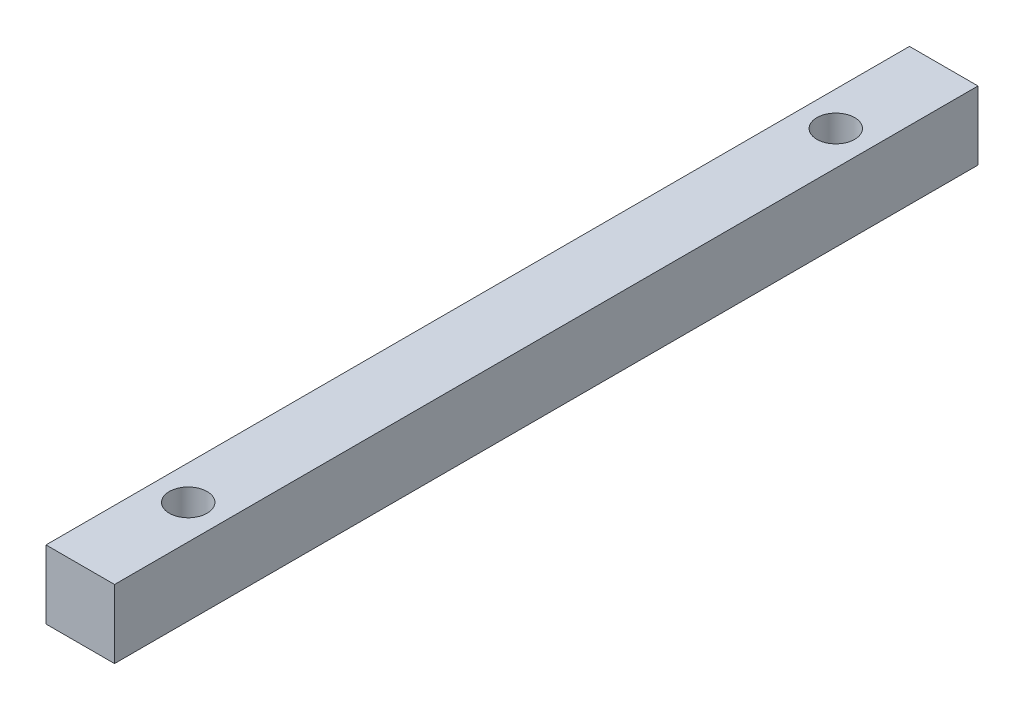
ISO-10303-21;
HEADER;
FILE_DESCRIPTION(('STEP AP214'),'2;1');
FILE_NAME('part.step','',(''),(''),'','','');
FILE_SCHEMA(('AUTOMOTIVE_DESIGN { 1 0 10303 214 1 1 1 1 }'));
ENDSEC;
DATA;
#1=APPLICATION_CONTEXT('core data for automotive mechanical design processes');
#2=APPLICATION_PROTOCOL_DEFINITION('international standard','automotive_design',2000,#1);
#3=PRODUCT_CONTEXT('',#1,'mechanical');
#4=PRODUCT('Part','Part','',(#3));
#5=PRODUCT_RELATED_PRODUCT_CATEGORY('part','',(#4));
#6=PRODUCT_DEFINITION_FORMATION('','',#4);
#7=PRODUCT_DEFINITION_CONTEXT('part definition',#1,'design');
#8=PRODUCT_DEFINITION('design','',#6,#7);
#9=PRODUCT_DEFINITION_SHAPE('','',#8);
#10=(LENGTH_UNIT() NAMED_UNIT(*) SI_UNIT(.MILLI.,.METRE.));
#11=(NAMED_UNIT(*) PLANE_ANGLE_UNIT() SI_UNIT($,.RADIAN.));
#12=(NAMED_UNIT(*) SI_UNIT($,.STERADIAN.) SOLID_ANGLE_UNIT());
#13=UNCERTAINTY_MEASURE_WITH_UNIT(LENGTH_MEASURE(1.E-05),#10,'distance_accuracy_value','');
#14=(GEOMETRIC_REPRESENTATION_CONTEXT(3) GLOBAL_UNCERTAINTY_ASSIGNED_CONTEXT((#13)) GLOBAL_UNIT_ASSIGNED_CONTEXT((#10,
#11,#12)) REPRESENTATION_CONTEXT('',''));
#15=CARTESIAN_POINT('',(0.,0.,0.));
#16=DIRECTION('',(0.,0.,1.));
#17=DIRECTION('',(1.,0.,0.));
#18=AXIS2_PLACEMENT_3D('',#15,#16,#17);
#19=CARTESIAN_POINT('',(3.175,-3.175,609.6));
#20=DIRECTION('',(-1.,0.,0.));
#21=DIRECTION('',(0.,0.,1.));
#22=AXIS2_PLACEMENT_3D('',#19,#20,#21);
#23=PLANE('',#22);
#24=DIRECTION('',(0.,0.,-1.));
#25=VECTOR('',#24,1.);
#26=CARTESIAN_POINT('',(3.175,3.175,609.6));
#27=LINE('',#26,#25);
#28=CARTESIAN_POINT('',(3.175,3.175,-529.6));
#29=VERTEX_POINT('',#28);
#30=CARTESIAN_POINT('',(3.175,3.175,-609.6));
#31=VERTEX_POINT('',#30);
#32=EDGE_CURVE('E47',#29,#31,#27,.T.);
#33=ORIENTED_EDGE('',*,*,#32,.F.);
#34=DIRECTION('',(0.,-1.,0.));
#35=VECTOR('',#34,1.);
#36=CARTESIAN_POINT('',(3.175,-3.175,-529.6));
#37=LINE('',#36,#35);
#38=CARTESIAN_POINT('',(3.175,-3.175,-529.6));
#39=VERTEX_POINT('',#38);
#40=EDGE_CURVE('E79',#29,#39,#37,.T.);
#41=ORIENTED_EDGE('',*,*,#40,.T.);
#42=DIRECTION('',(0.,0.,-1.));
#43=VECTOR('',#42,1.);
#44=CARTESIAN_POINT('',(3.175,-3.175,609.6));
#45=LINE('',#44,#43);
#46=CARTESIAN_POINT('',(3.175,-3.175,-609.6));
#47=VERTEX_POINT('',#46);
#48=EDGE_CURVE('E61',#39,#47,#45,.T.);
#49=ORIENTED_EDGE('',*,*,#48,.T.);
#50=DIRECTION('',(0.,1.,0.));
#51=VECTOR('',#50,1.);
#52=CARTESIAN_POINT('',(3.175,-3.175,-609.6));
#53=LINE('',#52,#51);
#54=EDGE_CURVE('E85',#47,#31,#53,.T.);
#55=ORIENTED_EDGE('',*,*,#54,.T.);
#56=EDGE_LOOP('',(#33,#41,#49,#55));
#57=FACE_BOUND('',#56,.T.);
#58=ADVANCED_FACE('F39',(#57),#23,.F.);
#59=CARTESIAN_POINT('',(-3.175,3.175,609.6));
#60=DIRECTION('',(0.,-1.,0.));
#61=DIRECTION('',(0.,0.,-1.));
#62=AXIS2_PLACEMENT_3D('',#59,#60,#61);
#63=PLANE('',#62);
#64=CARTESIAN_POINT('',(0.,3.175,-599.6));
#65=DIRECTION('',(0.,1.,0.));
#66=DIRECTION('',(0.,0.,1.));
#67=AXIS2_PLACEMENT_3D('',#64,#65,#66);
#68=CIRCLE('',#67,1.74999999999997);
#69=CARTESIAN_POINT('',(0.,3.175,-597.85));
#70=VERTEX_POINT('',#69);
#71=EDGE_CURVE('E129',#70,#70,#68,.T.);
#72=ORIENTED_EDGE('',*,*,#71,.F.);
#73=EDGE_LOOP('',(#72));
#74=FACE_BOUND('',#73,.T.);
#75=CARTESIAN_POINT('',(0.,3.175,-539.6));
#76=DIRECTION('',(0.,1.,0.));
#77=DIRECTION('',(0.,0.,1.));
#78=AXIS2_PLACEMENT_3D('',#75,#76,#77);
#79=CIRCLE('',#78,1.74999999999999);
#80=CARTESIAN_POINT('',(0.,3.175,-537.85));
#81=VERTEX_POINT('',#80);
#82=EDGE_CURVE('E132',#81,#81,#79,.T.);
#83=ORIENTED_EDGE('',*,*,#82,.F.);
#84=EDGE_LOOP('',(#83));
#85=FACE_BOUND('',#84,.T.);
#86=DIRECTION('',(0.,0.,-1.));
#87=VECTOR('',#86,1.);
#88=CARTESIAN_POINT('',(-3.175,3.175,609.6));
#89=LINE('',#88,#87);
#90=CARTESIAN_POINT('',(-3.175,3.175,-529.6));
#91=VERTEX_POINT('',#90);
#92=CARTESIAN_POINT('',(-3.175,3.175,-609.6));
#93=VERTEX_POINT('',#92);
#94=EDGE_CURVE('E97',#91,#93,#89,.T.);
#95=ORIENTED_EDGE('',*,*,#94,.F.);
#96=DIRECTION('',(1.,0.,0.));
#97=VECTOR('',#96,1.);
#98=CARTESIAN_POINT('',(-3.175,3.175,-529.6));
#99=LINE('',#98,#97);
#100=EDGE_CURVE('E86',#91,#29,#99,.T.);
#101=ORIENTED_EDGE('',*,*,#100,.T.);
#102=ORIENTED_EDGE('',*,*,#32,.T.);
#103=DIRECTION('',(-1.,0.,0.));
#104=VECTOR('',#103,1.);
#105=CARTESIAN_POINT('',(-3.175,3.175,-609.6));
#106=LINE('',#105,#104);
#107=EDGE_CURVE('E110',#31,#93,#106,.T.);
#108=ORIENTED_EDGE('',*,*,#107,.T.);
#109=EDGE_LOOP('',(#95,#101,#102,#108));
#110=FACE_BOUND('',#109,.T.);
#111=ADVANCED_FACE('F109',(#74,#85,#110),#63,.F.);
#112=CARTESIAN_POINT('',(-3.175,-3.175,609.6));
#113=DIRECTION('',(1.,0.,0.));
#114=DIRECTION('',(0.,1.,0.));
#115=AXIS2_PLACEMENT_3D('',#112,#113,#114);
#116=PLANE('',#115);
#117=DIRECTION('',(0.,0.,-1.));
#118=VECTOR('',#117,1.);
#119=CARTESIAN_POINT('',(-3.175,-3.175,609.6));
#120=LINE('',#119,#118);
#121=CARTESIAN_POINT('',(-3.175,-3.175,-529.6));
#122=VERTEX_POINT('',#121);
#123=CARTESIAN_POINT('',(-3.175,-3.175,-609.6));
#124=VERTEX_POINT('',#123);
#125=EDGE_CURVE('E93',#122,#124,#120,.T.);
#126=ORIENTED_EDGE('',*,*,#125,.F.);
#127=DIRECTION('',(0.,1.,0.));
#128=VECTOR('',#127,1.);
#129=CARTESIAN_POINT('',(-3.175,-3.175,-529.6));
#130=LINE('',#129,#128);
#131=EDGE_CURVE('E54',#122,#91,#130,.T.);
#132=ORIENTED_EDGE('',*,*,#131,.T.);
#133=ORIENTED_EDGE('',*,*,#94,.T.);
#134=DIRECTION('',(0.,-1.,0.));
#135=VECTOR('',#134,1.);
#136=CARTESIAN_POINT('',(-3.175,-3.175,-609.6));
#137=LINE('',#136,#135);
#138=EDGE_CURVE('E99',#93,#124,#137,.T.);
#139=ORIENTED_EDGE('',*,*,#138,.T.);
#140=EDGE_LOOP('',(#126,#132,#133,#139));
#141=FACE_BOUND('',#140,.T.);
#142=ADVANCED_FACE('F122',(#141),#116,.F.);
#143=CARTESIAN_POINT('',(-3.175,-3.175,609.6));
#144=DIRECTION('',(0.,1.,0.));
#145=DIRECTION('',(-1.,0.,0.));
#146=AXIS2_PLACEMENT_3D('',#143,#144,#145);
#147=PLANE('',#146);
#148=CARTESIAN_POINT('',(0.,-3.175,-599.6));
#149=DIRECTION('',(0.,1.,0.));
#150=DIRECTION('',(0.,0.,1.));
#151=AXIS2_PLACEMENT_3D('',#148,#149,#150);
#152=CIRCLE('',#151,1.74999999999997);
#153=CARTESIAN_POINT('',(0.,-3.175,-597.85));
#154=VERTEX_POINT('',#153);
#155=EDGE_CURVE('E124',#154,#154,#152,.T.);
#156=ORIENTED_EDGE('',*,*,#155,.T.);
#157=EDGE_LOOP('',(#156));
#158=FACE_BOUND('',#157,.T.);
#159=CARTESIAN_POINT('',(0.,-3.175,-539.6));
#160=DIRECTION('',(0.,1.,0.));
#161=DIRECTION('',(0.,0.,1.));
#162=AXIS2_PLACEMENT_3D('',#159,#160,#161);
#163=CIRCLE('',#162,1.74999999999999);
#164=CARTESIAN_POINT('',(0.,-3.175,-537.85));
#165=VERTEX_POINT('',#164);
#166=EDGE_CURVE('E136',#165,#165,#163,.T.);
#167=ORIENTED_EDGE('',*,*,#166,.T.);
#168=EDGE_LOOP('',(#167));
#169=FACE_BOUND('',#168,.T.);
#170=ORIENTED_EDGE('',*,*,#48,.F.);
#171=DIRECTION('',(-1.,0.,0.));
#172=VECTOR('',#171,1.);
#173=CARTESIAN_POINT('',(-3.175,-3.175,-529.6));
#174=LINE('',#173,#172);
#175=EDGE_CURVE('E11',#39,#122,#174,.T.);
#176=ORIENTED_EDGE('',*,*,#175,.T.);
#177=ORIENTED_EDGE('',*,*,#125,.T.);
#178=DIRECTION('',(1.,0.,0.));
#179=VECTOR('',#178,1.);
#180=CARTESIAN_POINT('',(-3.175,-3.175,-609.6));
#181=LINE('',#180,#179);
#182=EDGE_CURVE('E91',#124,#47,#181,.T.);
#183=ORIENTED_EDGE('',*,*,#182,.T.);
#184=EDGE_LOOP('',(#170,#176,#177,#183));
#185=FACE_BOUND('',#184,.T.);
#186=ADVANCED_FACE('F89',(#158,#169,#185),#147,.F.);
#187=CARTESIAN_POINT('',(0.,0.,-609.6));
#188=DIRECTION('',(0.,0.,-1.));
#189=DIRECTION('',(-1.,0.,0.));
#190=AXIS2_PLACEMENT_3D('',#187,#188,#189);
#191=PLANE('',#190);
#192=ORIENTED_EDGE('',*,*,#54,.F.);
#193=ORIENTED_EDGE('',*,*,#182,.F.);
#194=ORIENTED_EDGE('',*,*,#138,.F.);
#195=ORIENTED_EDGE('',*,*,#107,.F.);
#196=EDGE_LOOP('',(#192,#193,#194,#195));
#197=FACE_BOUND('',#196,.T.);
#198=ADVANCED_FACE('F113',(#197),#191,.T.);
#199=CARTESIAN_POINT('',(0.,0.,-529.6));
#200=DIRECTION('',(0.,0.,-1.));
#201=DIRECTION('',(-1.,0.,0.));
#202=AXIS2_PLACEMENT_3D('',#199,#200,#201);
#203=PLANE('',#202);
#204=ORIENTED_EDGE('',*,*,#100,.F.);
#205=ORIENTED_EDGE('',*,*,#131,.F.);
#206=ORIENTED_EDGE('',*,*,#175,.F.);
#207=ORIENTED_EDGE('',*,*,#40,.F.);
#208=EDGE_LOOP('',(#204,#205,#206,#207));
#209=FACE_BOUND('',#208,.T.);
#210=ADVANCED_FACE('F78',(#209),#203,.F.);
#211=CARTESIAN_POINT('',(0.,-3.175,-539.6));
#212=DIRECTION('',(0.,1.,0.));
#213=DIRECTION('',(0.,0.,1.));
#214=AXIS2_PLACEMENT_3D('',#211,#212,#213);
#215=CYLINDRICAL_SURFACE('',#214,1.74999999999999);
#216=ORIENTED_EDGE('',*,*,#166,.F.);
#217=EDGE_LOOP('',(#216));
#218=FACE_BOUND('',#217,.T.);
#219=ORIENTED_EDGE('',*,*,#82,.T.);
#220=EDGE_LOOP('',(#219));
#221=FACE_BOUND('',#220,.T.);
#222=ADVANCED_FACE('F150',(#218,#221),#215,.F.);
#223=CARTESIAN_POINT('',(0.,-3.175,-599.6));
#224=DIRECTION('',(0.,1.,0.));
#225=DIRECTION('',(0.,0.,1.));
#226=AXIS2_PLACEMENT_3D('',#223,#224,#225);
#227=CYLINDRICAL_SURFACE('',#226,1.74999999999997);
#228=ORIENTED_EDGE('',*,*,#155,.F.);
#229=EDGE_LOOP('',(#228));
#230=FACE_BOUND('',#229,.T.);
#231=ORIENTED_EDGE('',*,*,#71,.T.);
#232=EDGE_LOOP('',(#231));
#233=FACE_BOUND('',#232,.T.);
#234=ADVANCED_FACE('F144',(#230,#233),#227,.F.);
#235=CLOSED_SHELL('',(#58,#111,#142,#186,#198,#210,#222,#234));
#236=MANIFOLD_SOLID_BREP('B2',#235);
#237=ADVANCED_BREP_SHAPE_REPRESENTATION('',(#18,#236),#14);
#238=SHAPE_DEFINITION_REPRESENTATION(#9,#237);
ENDSEC;
END-ISO-10303-21;
